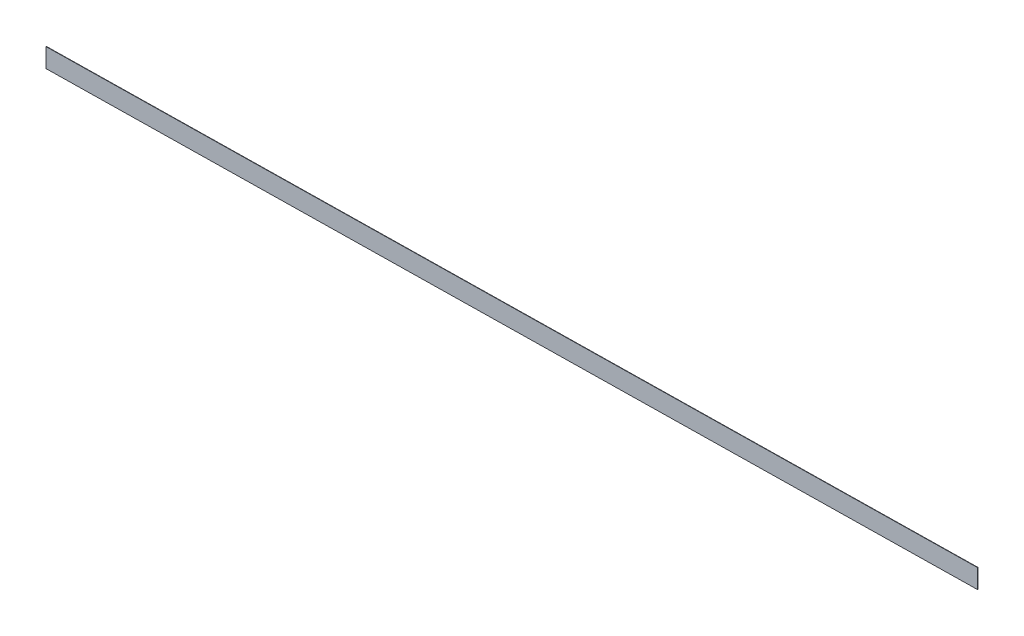
ISO-10303-21;
HEADER;
FILE_DESCRIPTION(('STEP AP214'),'2;1');
FILE_NAME('part.step','',(''),(''),'','','');
FILE_SCHEMA(('AUTOMOTIVE_DESIGN { 1 0 10303 214 1 1 1 1 }'));
ENDSEC;
DATA;
#1=APPLICATION_CONTEXT('core data for automotive mechanical design processes');
#2=APPLICATION_PROTOCOL_DEFINITION('international standard','automotive_design',2000,#1);
#3=PRODUCT_CONTEXT('',#1,'mechanical');
#4=PRODUCT('Part','Part','',(#3));
#5=PRODUCT_RELATED_PRODUCT_CATEGORY('part','',(#4));
#6=PRODUCT_DEFINITION_FORMATION('','',#4);
#7=PRODUCT_DEFINITION_CONTEXT('part definition',#1,'design');
#8=PRODUCT_DEFINITION('design','',#6,#7);
#9=PRODUCT_DEFINITION_SHAPE('','',#8);
#10=(LENGTH_UNIT() NAMED_UNIT(*) SI_UNIT(.MILLI.,.METRE.));
#11=(NAMED_UNIT(*) PLANE_ANGLE_UNIT() SI_UNIT($,.RADIAN.));
#12=(NAMED_UNIT(*) SI_UNIT($,.STERADIAN.) SOLID_ANGLE_UNIT());
#13=UNCERTAINTY_MEASURE_WITH_UNIT(LENGTH_MEASURE(1.E-05),#10,'distance_accuracy_value','');
#14=(GEOMETRIC_REPRESENTATION_CONTEXT(3) GLOBAL_UNCERTAINTY_ASSIGNED_CONTEXT((#13)) GLOBAL_UNIT_ASSIGNED_CONTEXT((#10,
#11,#12)) REPRESENTATION_CONTEXT('',''));
#15=CARTESIAN_POINT('',(0.,0.,0.));
#16=DIRECTION('',(0.,0.,1.));
#17=DIRECTION('',(1.,0.,0.));
#18=AXIS2_PLACEMENT_3D('',#15,#16,#17);
#19=CARTESIAN_POINT('',(-0.00159134789711462,15.,4.90001266274237));
#20=DIRECTION('',(-0.999873372576265,0.,0.0159134789711427));
#21=DIRECTION('',(0.,1.,0.));
#22=AXIS2_PLACEMENT_3D('',#19,#20,#21);
#23=PLANE('',#22);
#24=DIRECTION('',(-0.0159134789711427,0.,-0.999873372576266));
#25=VECTOR('',#24,1.);
#26=CARTESIAN_POINT('',(-0.00159134789711462,20.,4.90001266274237));
#27=LINE('',#26,#25);
#28=CARTESIAN_POINT('',(0.,20.,5.));
#29=VERTEX_POINT('',#28);
#30=CARTESIAN_POINT('',(-0.00318269579422888,20.,4.80002532548475));
#31=VERTEX_POINT('',#30);
#32=EDGE_CURVE('E13',#29,#31,#27,.T.);
#33=ORIENTED_EDGE('',*,*,#32,.F.);
#34=DIRECTION('',(0.,1.,0.));
#35=VECTOR('',#34,1.);
#36=CARTESIAN_POINT('',(0.,15.,5.));
#37=LINE('',#36,#35);
#38=CARTESIAN_POINT('',(0.,10.,5.));
#39=VERTEX_POINT('',#38);
#40=EDGE_CURVE('E334',#39,#29,#37,.T.);
#41=ORIENTED_EDGE('',*,*,#40,.F.);
#42=DIRECTION('',(-0.0159134789711427,0.,-0.999873372576266));
#43=VECTOR('',#42,1.);
#44=CARTESIAN_POINT('',(-0.00159134789711462,10.,4.90001266274237));
#45=LINE('',#44,#43);
#46=CARTESIAN_POINT('',(-0.00318269579422888,10.,4.80002532548475));
#47=VERTEX_POINT('',#46);
#48=EDGE_CURVE('E307',#39,#47,#45,.T.);
#49=ORIENTED_EDGE('',*,*,#48,.T.);
#50=DIRECTION('',(0.,1.,0.));
#51=VECTOR('',#50,1.);
#52=CARTESIAN_POINT('',(-0.00318269579422888,15.,4.80002532548475));
#53=LINE('',#52,#51);
#54=EDGE_CURVE('E336',#47,#31,#53,.T.);
#55=ORIENTED_EDGE('',*,*,#54,.T.);
#56=EDGE_LOOP('',(#33,#41,#49,#55));
#57=FACE_BOUND('',#56,.T.);
#58=ADVANCED_FACE('F297',(#57),#23,.F.);
#59=CARTESIAN_POINT('',(-0.00159134789711424,10.,4.90001266274237));
#60=DIRECTION('',(0.,-1.,0.));
#61=DIRECTION('',(-0.999873372576265,0.,0.0159134789711427));
#62=AXIS2_PLACEMENT_3D('',#59,#60,#61);
#63=PLANE('',#62);
#64=ORIENTED_EDGE('',*,*,#48,.F.);
#65=DIRECTION('',(-0.999873372576265,0.,0.0159134789711427));
#66=VECTOR('',#65,1.);
#67=CARTESIAN_POINT('',(0.,10.,5.));
#68=LINE('',#67,#66);
#69=CARTESIAN_POINT('',(-480.421960733822,10.,12.6461529820664));
#70=VERTEX_POINT('',#69);
#71=EDGE_CURVE('E348',#39,#70,#68,.T.);
#72=ORIENTED_EDGE('',*,*,#71,.T.);
#73=DIRECTION('',(-0.0159134789711427,0.,-0.999873372576266));
#74=VECTOR('',#73,1.);
#75=CARTESIAN_POINT('',(-480.423552081719,10.,12.5461656448088));
#76=LINE('',#75,#74);
#77=CARTESIAN_POINT('',(-480.425143429616,10.,12.4461783075512));
#78=VERTEX_POINT('',#77);
#79=EDGE_CURVE('E357',#70,#78,#76,.T.);
#80=ORIENTED_EDGE('',*,*,#79,.T.);
#81=DIRECTION('',(-0.999873372576265,0.,0.0159134789711427));
#82=VECTOR('',#81,1.);
#83=CARTESIAN_POINT('',(-0.00318269579422852,10.,4.80002532548475));
#84=LINE('',#83,#82);
#85=EDGE_CURVE('E352',#47,#78,#84,.T.);
#86=ORIENTED_EDGE('',*,*,#85,.F.);
#87=EDGE_LOOP('',(#64,#72,#80,#86));
#88=FACE_BOUND('',#87,.T.);
#89=ADVANCED_FACE('F366',(#88),#63,.T.);
#90=CARTESIAN_POINT('',(-480.423552081719,15.,12.5461656448088));
#91=DIRECTION('',(-0.999873372576265,0.,0.0159134789711427));
#92=DIRECTION('',(0.,1.,0.));
#93=AXIS2_PLACEMENT_3D('',#90,#91,#92);
#94=PLANE('',#93);
#95=ORIENTED_EDGE('',*,*,#79,.F.);
#96=DIRECTION('',(0.,1.,0.));
#97=VECTOR('',#96,1.);
#98=CARTESIAN_POINT('',(-480.421960733822,15.,12.6461529820664));
#99=LINE('',#98,#97);
#100=CARTESIAN_POINT('',(-480.421960733822,20.,12.6461529820664));
#101=VERTEX_POINT('',#100);
#102=EDGE_CURVE('E350',#70,#101,#99,.T.);
#103=ORIENTED_EDGE('',*,*,#102,.T.);
#104=DIRECTION('',(-0.0159134789711427,0.,-0.999873372576266));
#105=VECTOR('',#104,1.);
#106=CARTESIAN_POINT('',(-480.423552081719,20.,12.5461656448088));
#107=LINE('',#106,#105);
#108=CARTESIAN_POINT('',(-480.425143429616,20.,12.4461783075512));
#109=VERTEX_POINT('',#108);
#110=EDGE_CURVE('E301',#101,#109,#107,.T.);
#111=ORIENTED_EDGE('',*,*,#110,.T.);
#112=DIRECTION('',(0.,1.,0.));
#113=VECTOR('',#112,1.);
#114=CARTESIAN_POINT('',(-480.425143429616,15.,12.4461783075512));
#115=LINE('',#114,#113);
#116=EDGE_CURVE('E367',#78,#109,#115,.T.);
#117=ORIENTED_EDGE('',*,*,#116,.F.);
#118=EDGE_LOOP('',(#95,#103,#111,#117));
#119=FACE_BOUND('',#118,.T.);
#120=ADVANCED_FACE('F371',(#119),#94,.T.);
#121=CARTESIAN_POINT('',(-0.00159134789711424,20.,4.90001266274237));
#122=DIRECTION('',(0.,-1.,0.));
#123=DIRECTION('',(-0.999873372576265,0.,0.0159134789711427));
#124=AXIS2_PLACEMENT_3D('',#121,#122,#123);
#125=PLANE('',#124);
#126=DIRECTION('',(-0.999873372576265,0.,0.0159134789711427));
#127=VECTOR('',#126,1.);
#128=CARTESIAN_POINT('',(0.,20.,5.));
#129=LINE('',#128,#127);
#130=EDGE_CURVE('E346',#101,#29,#129,.F.);
#131=ORIENTED_EDGE('',*,*,#130,.T.);
#132=ORIENTED_EDGE('',*,*,#32,.T.);
#133=DIRECTION('',(-0.999873372576265,0.,0.0159134789711427));
#134=VECTOR('',#133,1.);
#135=CARTESIAN_POINT('',(-0.00318269579422852,20.,4.80002532548475));
#136=LINE('',#135,#134);
#137=EDGE_CURVE('E365',#109,#31,#136,.F.);
#138=ORIENTED_EDGE('',*,*,#137,.F.);
#139=ORIENTED_EDGE('',*,*,#110,.F.);
#140=EDGE_LOOP('',(#131,#132,#138,#139));
#141=FACE_BOUND('',#140,.T.);
#142=ADVANCED_FACE('F299',(#141),#125,.F.);
#143=CARTESIAN_POINT('',(-0.00318269579422852,15.,4.80002532548475));
#144=DIRECTION('',(-0.0159134789711427,0.,-0.999873372576266));
#145=DIRECTION('',(-0.999873372576265,0.,0.0159134789711427));
#146=AXIS2_PLACEMENT_3D('',#143,#144,#145);
#147=PLANE('',#146);
#148=ORIENTED_EDGE('',*,*,#116,.T.);
#149=ORIENTED_EDGE('',*,*,#137,.T.);
#150=ORIENTED_EDGE('',*,*,#54,.F.);
#151=ORIENTED_EDGE('',*,*,#85,.T.);
#152=EDGE_LOOP('',(#148,#149,#150,#151));
#153=FACE_BOUND('',#152,.T.);
#154=ADVANCED_FACE('F364',(#153),#147,.T.);
#155=CARTESIAN_POINT('',(0.,15.,5.));
#156=DIRECTION('',(-0.0159134789711427,0.,-0.999873372576266));
#157=DIRECTION('',(-0.999873372576265,0.,0.0159134789711427));
#158=AXIS2_PLACEMENT_3D('',#155,#156,#157);
#159=PLANE('',#158);
#160=ORIENTED_EDGE('',*,*,#102,.F.);
#161=ORIENTED_EDGE('',*,*,#71,.F.);
#162=ORIENTED_EDGE('',*,*,#40,.T.);
#163=ORIENTED_EDGE('',*,*,#130,.F.);
#164=EDGE_LOOP('',(#160,#161,#162,#163));
#165=FACE_BOUND('',#164,.T.);
#166=ADVANCED_FACE('F345',(#165),#159,.F.);
#167=CLOSED_SHELL('',(#58,#89,#120,#142,#154,#166));
#168=MANIFOLD_SOLID_BREP('B2',#167);
#169=ADVANCED_BREP_SHAPE_REPRESENTATION('',(#18,#168),#14);
#170=SHAPE_DEFINITION_REPRESENTATION(#9,#169);
ENDSEC;
END-ISO-10303-21;
